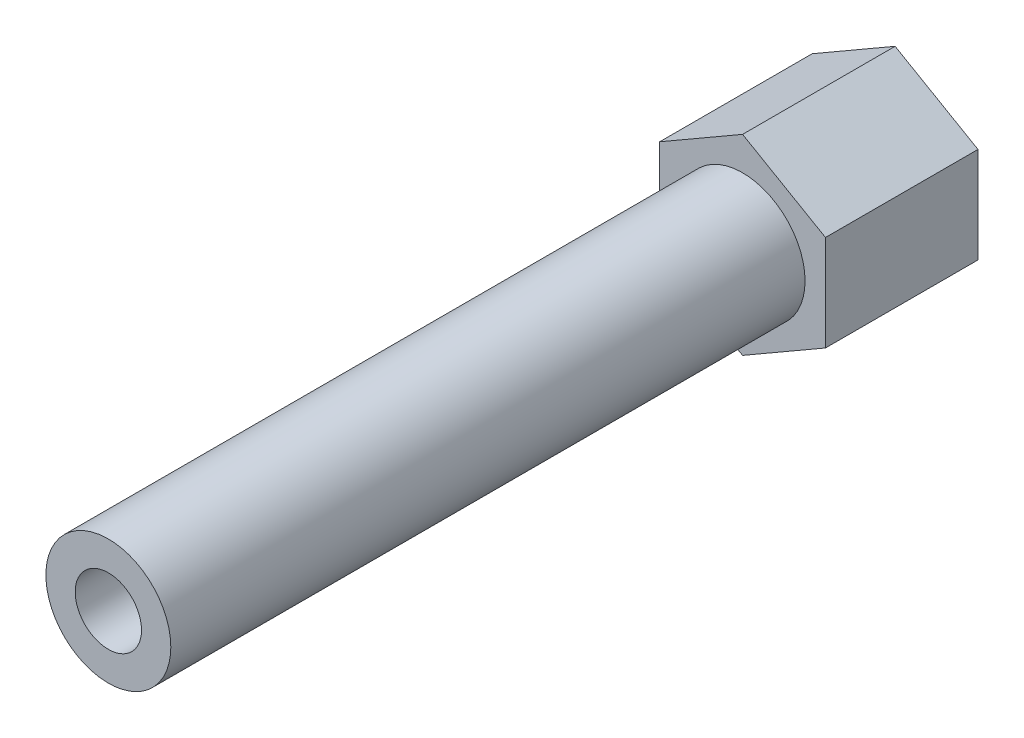
ISO-10303-21;
HEADER;
FILE_DESCRIPTION(('STEP AP214'),'2;1');
FILE_NAME('part.step','',(''),(''),'','','');
FILE_SCHEMA(('AUTOMOTIVE_DESIGN { 1 0 10303 214 1 1 1 1 }'));
ENDSEC;
DATA;
#1=APPLICATION_CONTEXT('core data for automotive mechanical design processes');
#2=APPLICATION_PROTOCOL_DEFINITION('international standard','automotive_design',2000,#1);
#3=PRODUCT_CONTEXT('',#1,'mechanical');
#4=PRODUCT('Part','Part','',(#3));
#5=PRODUCT_RELATED_PRODUCT_CATEGORY('part','',(#4));
#6=PRODUCT_DEFINITION_FORMATION('','',#4);
#7=PRODUCT_DEFINITION_CONTEXT('part definition',#1,'design');
#8=PRODUCT_DEFINITION('design','',#6,#7);
#9=PRODUCT_DEFINITION_SHAPE('','',#8);
#10=(LENGTH_UNIT() NAMED_UNIT(*) SI_UNIT(.MILLI.,.METRE.));
#11=(NAMED_UNIT(*) PLANE_ANGLE_UNIT() SI_UNIT($,.RADIAN.));
#12=(NAMED_UNIT(*) SI_UNIT($,.STERADIAN.) SOLID_ANGLE_UNIT());
#13=UNCERTAINTY_MEASURE_WITH_UNIT(LENGTH_MEASURE(1.E-05),#10,'distance_accuracy_value','');
#14=(GEOMETRIC_REPRESENTATION_CONTEXT(3) GLOBAL_UNCERTAINTY_ASSIGNED_CONTEXT((#13)) GLOBAL_UNIT_ASSIGNED_CONTEXT((#10,
#11,#12)) REPRESENTATION_CONTEXT('',''));
#15=CARTESIAN_POINT('',(0.,0.,0.));
#16=DIRECTION('',(0.,0.,1.));
#17=DIRECTION('',(1.,0.,0.));
#18=AXIS2_PLACEMENT_3D('',#15,#16,#17);
#19=CARTESIAN_POINT('',(6.25,3.60843918243517,11.5));
#20=DIRECTION('',(-0.5,-0.866025403784439,0.));
#21=DIRECTION('',(0.866025403784439,-0.5,0.));
#22=AXIS2_PLACEMENT_3D('',#19,#20,#21);
#23=PLANE('',#22);
#24=DIRECTION('',(-0.866025403784439,0.5,0.));
#25=VECTOR('',#24,1.);
#26=CARTESIAN_POINT('',(6.25,3.60843918243517,0.));
#27=LINE('',#26,#25);
#28=CARTESIAN_POINT('',(6.25,3.60843918243517,0.));
#29=VERTEX_POINT('',#28);
#30=CARTESIAN_POINT('',(0.,7.21687836487032,0.));
#31=VERTEX_POINT('',#30);
#32=EDGE_CURVE('E125',#29,#31,#27,.T.);
#33=ORIENTED_EDGE('',*,*,#32,.T.);
#34=DIRECTION('',(0.,0.,-1.));
#35=VECTOR('',#34,1.);
#36=CARTESIAN_POINT('',(0.,7.21687836487032,11.5));
#37=LINE('',#36,#35);
#38=CARTESIAN_POINT('',(0.,7.21687836487032,11.5));
#39=VERTEX_POINT('',#38);
#40=EDGE_CURVE('E42',#39,#31,#37,.T.);
#41=ORIENTED_EDGE('',*,*,#40,.F.);
#42=DIRECTION('',(-0.866025403784439,0.5,0.));
#43=VECTOR('',#42,1.);
#44=CARTESIAN_POINT('',(6.25,3.60843918243517,11.5));
#45=LINE('',#44,#43);
#46=CARTESIAN_POINT('',(6.25,3.60843918243517,11.5));
#47=VERTEX_POINT('',#46);
#48=EDGE_CURVE('E136',#47,#39,#45,.T.);
#49=ORIENTED_EDGE('',*,*,#48,.F.);
#50=DIRECTION('',(0.,0.,-1.));
#51=VECTOR('',#50,1.);
#52=CARTESIAN_POINT('',(6.25,3.60843918243517,11.5));
#53=LINE('',#52,#51);
#54=EDGE_CURVE('E121',#47,#29,#53,.T.);
#55=ORIENTED_EDGE('',*,*,#54,.T.);
#56=EDGE_LOOP('',(#33,#41,#49,#55));
#57=FACE_BOUND('',#56,.T.);
#58=ADVANCED_FACE('F39',(#57),#23,.F.);
#59=CARTESIAN_POINT('',(0.,7.21687836487032,11.5));
#60=DIRECTION('',(0.5,-0.866025403784439,0.));
#61=DIRECTION('',(0.866025403784439,0.5,0.));
#62=AXIS2_PLACEMENT_3D('',#59,#60,#61);
#63=PLANE('',#62);
#64=DIRECTION('',(-0.866025403784439,-0.5,0.));
#65=VECTOR('',#64,1.);
#66=CARTESIAN_POINT('',(0.,7.21687836487032,0.));
#67=LINE('',#66,#65);
#68=CARTESIAN_POINT('',(-6.25,3.60843918243516,0.));
#69=VERTEX_POINT('',#68);
#70=EDGE_CURVE('E128',#31,#69,#67,.T.);
#71=ORIENTED_EDGE('',*,*,#70,.T.);
#72=DIRECTION('',(0.,0.,-1.));
#73=VECTOR('',#72,1.);
#74=CARTESIAN_POINT('',(-6.25,3.60843918243516,11.5));
#75=LINE('',#74,#73);
#76=CARTESIAN_POINT('',(-6.25,3.60843918243516,11.5));
#77=VERTEX_POINT('',#76);
#78=EDGE_CURVE('E139',#77,#69,#75,.T.);
#79=ORIENTED_EDGE('',*,*,#78,.F.);
#80=DIRECTION('',(-0.866025403784439,-0.5,0.));
#81=VECTOR('',#80,1.);
#82=CARTESIAN_POINT('',(0.,7.21687836487032,11.5));
#83=LINE('',#82,#81);
#84=EDGE_CURVE('E94',#39,#77,#83,.T.);
#85=ORIENTED_EDGE('',*,*,#84,.F.);
#86=ORIENTED_EDGE('',*,*,#40,.T.);
#87=EDGE_LOOP('',(#71,#79,#85,#86));
#88=FACE_BOUND('',#87,.T.);
#89=ADVANCED_FACE('F144',(#88),#63,.F.);
#90=CARTESIAN_POINT('',(-6.25,3.60843918243516,11.5));
#91=DIRECTION('',(1.,0.,0.));
#92=DIRECTION('',(0.,1.,0.));
#93=AXIS2_PLACEMENT_3D('',#90,#91,#92);
#94=PLANE('',#93);
#95=DIRECTION('',(0.,-1.,0.));
#96=VECTOR('',#95,1.);
#97=CARTESIAN_POINT('',(-6.25,3.60843918243516,0.));
#98=LINE('',#97,#96);
#99=CARTESIAN_POINT('',(-6.25,-3.60843918243516,0.));
#100=VERTEX_POINT('',#99);
#101=EDGE_CURVE('E131',#69,#100,#98,.T.);
#102=ORIENTED_EDGE('',*,*,#101,.T.);
#103=DIRECTION('',(0.,0.,-1.));
#104=VECTOR('',#103,1.);
#105=CARTESIAN_POINT('',(-6.25,-3.60843918243516,11.5));
#106=LINE('',#105,#104);
#107=CARTESIAN_POINT('',(-6.25,-3.60843918243516,11.5));
#108=VERTEX_POINT('',#107);
#109=EDGE_CURVE('E116',#108,#100,#106,.T.);
#110=ORIENTED_EDGE('',*,*,#109,.F.);
#111=DIRECTION('',(0.,-1.,0.));
#112=VECTOR('',#111,1.);
#113=CARTESIAN_POINT('',(-6.25,3.60843918243516,11.5));
#114=LINE('',#113,#112);
#115=EDGE_CURVE('E107',#77,#108,#114,.T.);
#116=ORIENTED_EDGE('',*,*,#115,.F.);
#117=ORIENTED_EDGE('',*,*,#78,.T.);
#118=EDGE_LOOP('',(#102,#110,#116,#117));
#119=FACE_BOUND('',#118,.T.);
#120=ADVANCED_FACE('F150',(#119),#94,.F.);
#121=CARTESIAN_POINT('',(-6.25,-3.60843918243516,11.5));
#122=DIRECTION('',(0.5,0.866025403784439,0.));
#123=DIRECTION('',(-0.866025403784439,0.5,0.));
#124=AXIS2_PLACEMENT_3D('',#121,#122,#123);
#125=PLANE('',#124);
#126=DIRECTION('',(0.866025403784439,-0.5,0.));
#127=VECTOR('',#126,1.);
#128=CARTESIAN_POINT('',(-6.25,-3.60843918243516,0.));
#129=LINE('',#128,#127);
#130=CARTESIAN_POINT('',(0.,-7.21687836487032,0.));
#131=VERTEX_POINT('',#130);
#132=EDGE_CURVE('E115',#100,#131,#129,.T.);
#133=ORIENTED_EDGE('',*,*,#132,.T.);
#134=DIRECTION('',(0.,0.,-1.));
#135=VECTOR('',#134,1.);
#136=CARTESIAN_POINT('',(0.,-7.21687836487032,11.5));
#137=LINE('',#136,#135);
#138=CARTESIAN_POINT('',(0.,-7.21687836487032,11.5));
#139=VERTEX_POINT('',#138);
#140=EDGE_CURVE('E112',#139,#131,#137,.T.);
#141=ORIENTED_EDGE('',*,*,#140,.F.);
#142=DIRECTION('',(0.866025403784439,-0.5,0.));
#143=VECTOR('',#142,1.);
#144=CARTESIAN_POINT('',(-6.25,-3.60843918243516,11.5));
#145=LINE('',#144,#143);
#146=EDGE_CURVE('E101',#108,#139,#145,.T.);
#147=ORIENTED_EDGE('',*,*,#146,.F.);
#148=ORIENTED_EDGE('',*,*,#109,.T.);
#149=EDGE_LOOP('',(#133,#141,#147,#148));
#150=FACE_BOUND('',#149,.T.);
#151=ADVANCED_FACE('F113',(#150),#125,.F.);
#152=CARTESIAN_POINT('',(0.,-7.21687836487032,11.5));
#153=DIRECTION('',(-0.5,0.866025403784439,0.));
#154=DIRECTION('',(-0.866025403784439,-0.5,0.));
#155=AXIS2_PLACEMENT_3D('',#152,#153,#154);
#156=PLANE('',#155);
#157=DIRECTION('',(0.866025403784439,0.5,0.));
#158=VECTOR('',#157,1.);
#159=CARTESIAN_POINT('',(0.,-7.21687836487032,0.));
#160=LINE('',#159,#158);
#161=CARTESIAN_POINT('',(6.25,-3.60843918243516,0.));
#162=VERTEX_POINT('',#161);
#163=EDGE_CURVE('E79',#131,#162,#160,.T.);
#164=ORIENTED_EDGE('',*,*,#163,.T.);
#165=DIRECTION('',(0.,0.,-1.));
#166=VECTOR('',#165,1.);
#167=CARTESIAN_POINT('',(6.25,-3.60843918243516,11.5));
#168=LINE('',#167,#166);
#169=CARTESIAN_POINT('',(6.25,-3.60843918243516,11.5));
#170=VERTEX_POINT('',#169);
#171=EDGE_CURVE('E117',#170,#162,#168,.T.);
#172=ORIENTED_EDGE('',*,*,#171,.F.);
#173=DIRECTION('',(0.866025403784439,0.5,0.));
#174=VECTOR('',#173,1.);
#175=CARTESIAN_POINT('',(0.,-7.21687836487032,11.5));
#176=LINE('',#175,#174);
#177=EDGE_CURVE('E105',#139,#170,#176,.T.);
#178=ORIENTED_EDGE('',*,*,#177,.F.);
#179=ORIENTED_EDGE('',*,*,#140,.T.);
#180=EDGE_LOOP('',(#164,#172,#178,#179));
#181=FACE_BOUND('',#180,.T.);
#182=ADVANCED_FACE('F119',(#181),#156,.F.);
#183=CARTESIAN_POINT('',(6.25,-3.60843918243516,11.5));
#184=DIRECTION('',(-1.,0.,0.));
#185=DIRECTION('',(0.,-1.,0.));
#186=AXIS2_PLACEMENT_3D('',#183,#184,#185);
#187=PLANE('',#186);
#188=DIRECTION('',(0.,1.,0.));
#189=VECTOR('',#188,1.);
#190=CARTESIAN_POINT('',(6.25,-3.60843918243516,0.));
#191=LINE('',#190,#189);
#192=EDGE_CURVE('E85',#162,#29,#191,.T.);
#193=ORIENTED_EDGE('',*,*,#192,.T.);
#194=ORIENTED_EDGE('',*,*,#54,.F.);
#195=DIRECTION('',(0.,1.,0.));
#196=VECTOR('',#195,1.);
#197=CARTESIAN_POINT('',(6.25,-3.60843918243516,11.5));
#198=LINE('',#197,#196);
#199=EDGE_CURVE('E56',#170,#47,#198,.T.);
#200=ORIENTED_EDGE('',*,*,#199,.F.);
#201=ORIENTED_EDGE('',*,*,#171,.T.);
#202=EDGE_LOOP('',(#193,#194,#200,#201));
#203=FACE_BOUND('',#202,.T.);
#204=ADVANCED_FACE('F184',(#203),#187,.F.);
#205=CARTESIAN_POINT('',(0.,0.,11.5));
#206=DIRECTION('',(0.,0.,1.));
#207=DIRECTION('',(1.,0.,0.));
#208=AXIS2_PLACEMENT_3D('',#205,#206,#207);
#209=PLANE('',#208);
#210=CARTESIAN_POINT('',(0.,0.,11.5));
#211=DIRECTION('',(0.,0.,1.));
#212=DIRECTION('',(1.,0.,0.));
#213=AXIS2_PLACEMENT_3D('',#210,#211,#212);
#214=CIRCLE('',#213,4.71);
#215=CARTESIAN_POINT('',(4.71,0.,11.5));
#216=VERTEX_POINT('',#215);
#217=EDGE_CURVE('E11',#216,#216,#214,.T.);
#218=ORIENTED_EDGE('',*,*,#217,.F.);
#219=EDGE_LOOP('',(#218));
#220=FACE_BOUND('',#219,.T.);
#221=ORIENTED_EDGE('',*,*,#48,.T.);
#222=ORIENTED_EDGE('',*,*,#84,.T.);
#223=ORIENTED_EDGE('',*,*,#115,.T.);
#224=ORIENTED_EDGE('',*,*,#146,.T.);
#225=ORIENTED_EDGE('',*,*,#177,.T.);
#226=ORIENTED_EDGE('',*,*,#199,.T.);
#227=EDGE_LOOP('',(#221,#222,#223,#224,#225,#226));
#228=FACE_BOUND('',#227,.T.);
#229=ADVANCED_FACE('F103',(#220,#228),#209,.T.);
#230=CARTESIAN_POINT('',(0.,0.,0.));
#231=DIRECTION('',(0.,0.,1.));
#232=DIRECTION('',(1.,0.,0.));
#233=AXIS2_PLACEMENT_3D('',#230,#231,#232);
#234=PLANE('',#233);
#235=ORIENTED_EDGE('',*,*,#32,.F.);
#236=ORIENTED_EDGE('',*,*,#192,.F.);
#237=ORIENTED_EDGE('',*,*,#163,.F.);
#238=ORIENTED_EDGE('',*,*,#132,.F.);
#239=ORIENTED_EDGE('',*,*,#101,.F.);
#240=ORIENTED_EDGE('',*,*,#70,.F.);
#241=EDGE_LOOP('',(#235,#236,#237,#238,#239,#240));
#242=FACE_BOUND('',#241,.T.);
#243=ADVANCED_FACE('F149',(#242),#234,.F.);
#244=CARTESIAN_POINT('',(0.,0.,59.32));
#245=DIRECTION('',(0.,0.,-1.));
#246=DIRECTION('',(-1.,0.,0.));
#247=AXIS2_PLACEMENT_3D('',#244,#245,#246);
#248=CYLINDRICAL_SURFACE('',#247,4.71);
#249=CARTESIAN_POINT('',(0.,0.,59.32));
#250=DIRECTION('',(0.,0.,1.));
#251=DIRECTION('',(1.,0.,0.));
#252=AXIS2_PLACEMENT_3D('',#249,#250,#251);
#253=CIRCLE('',#252,4.71);
#254=CARTESIAN_POINT('',(4.71,0.,59.32));
#255=VERTEX_POINT('',#254);
#256=EDGE_CURVE('E129',#255,#255,#253,.T.);
#257=ORIENTED_EDGE('',*,*,#256,.F.);
#258=EDGE_LOOP('',(#257));
#259=FACE_BOUND('',#258,.T.);
#260=ORIENTED_EDGE('',*,*,#217,.T.);
#261=EDGE_LOOP('',(#260));
#262=FACE_BOUND('',#261,.T.);
#263=ADVANCED_FACE('F174',(#259,#262),#248,.T.);
#264=CARTESIAN_POINT('',(0.,0.,59.32));
#265=DIRECTION('',(0.,0.,1.));
#266=DIRECTION('',(1.,0.,0.));
#267=AXIS2_PLACEMENT_3D('',#264,#265,#266);
#268=PLANE('',#267);
#269=CARTESIAN_POINT('',(0.,0.,59.32));
#270=DIRECTION('',(0.,0.,1.));
#271=DIRECTION('',(1.,0.,0.));
#272=AXIS2_PLACEMENT_3D('',#269,#270,#271);
#273=CIRCLE('',#272,2.5);
#274=CARTESIAN_POINT('',(2.5,0.,59.32));
#275=VERTEX_POINT('',#274);
#276=EDGE_CURVE('E157',#275,#275,#273,.T.);
#277=ORIENTED_EDGE('',*,*,#276,.F.);
#278=EDGE_LOOP('',(#277));
#279=FACE_BOUND('',#278,.T.);
#280=ORIENTED_EDGE('',*,*,#256,.T.);
#281=EDGE_LOOP('',(#280));
#282=FACE_BOUND('',#281,.T.);
#283=ADVANCED_FACE('F168',(#279,#282),#268,.T.);
#284=CARTESIAN_POINT('',(0.,0.,49.32));
#285=DIRECTION('',(0.,0.,1.));
#286=DIRECTION('',(1.,0.,0.));
#287=AXIS2_PLACEMENT_3D('',#284,#285,#286);
#288=CYLINDRICAL_SURFACE('',#287,2.5);
#289=CARTESIAN_POINT('',(0.,0.,49.32));
#290=DIRECTION('',(0.,0.,1.));
#291=DIRECTION('',(1.,0.,0.));
#292=AXIS2_PLACEMENT_3D('',#289,#290,#291);
#293=CIRCLE('',#292,2.5);
#294=CARTESIAN_POINT('',(2.5,0.,49.32));
#295=VERTEX_POINT('',#294);
#296=EDGE_CURVE('E156',#295,#295,#293,.T.);
#297=ORIENTED_EDGE('',*,*,#296,.F.);
#298=EDGE_LOOP('',(#297));
#299=FACE_BOUND('',#298,.T.);
#300=ORIENTED_EDGE('',*,*,#276,.T.);
#301=EDGE_LOOP('',(#300));
#302=FACE_BOUND('',#301,.T.);
#303=ADVANCED_FACE('F165',(#299,#302),#288,.F.);
#304=CARTESIAN_POINT('',(0.,0.,49.32));
#305=DIRECTION('',(0.,0.,1.));
#306=DIRECTION('',(1.,0.,0.));
#307=AXIS2_PLACEMENT_3D('',#304,#305,#306);
#308=PLANE('',#307);
#309=ORIENTED_EDGE('',*,*,#296,.T.);
#310=EDGE_LOOP('',(#309));
#311=FACE_BOUND('',#310,.T.);
#312=ADVANCED_FACE('F163',(#311),#308,.T.);
#313=CLOSED_SHELL('',(#58,#89,#120,#151,#182,#204,#229,#243,#263,#283,#303,#312));
#314=MANIFOLD_SOLID_BREP('B2',#313);
#315=ADVANCED_BREP_SHAPE_REPRESENTATION('',(#18,#314),#14);
#316=SHAPE_DEFINITION_REPRESENTATION(#9,#315);
ENDSEC;
END-ISO-10303-21;
